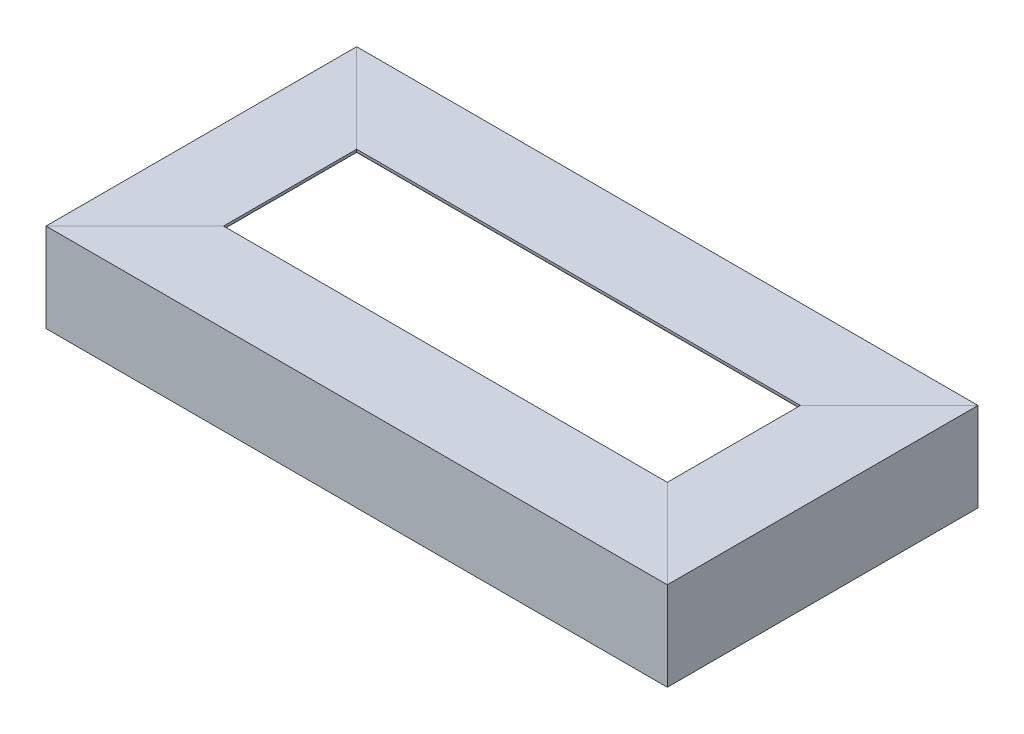
ISO-10303-21;
HEADER;
FILE_DESCRIPTION(('STEP AP214'),'2;1');
FILE_NAME('part.step','',(''),(''),'','','');
FILE_SCHEMA(('AUTOMOTIVE_DESIGN { 1 0 10303 214 1 1 1 1 }'));
ENDSEC;
DATA;
#1=APPLICATION_CONTEXT('core data for automotive mechanical design processes');
#2=APPLICATION_PROTOCOL_DEFINITION('international standard','automotive_design',2000,#1);
#3=PRODUCT_CONTEXT('',#1,'mechanical');
#4=PRODUCT('Part','Part','',(#3));
#5=PRODUCT_RELATED_PRODUCT_CATEGORY('part','',(#4));
#6=PRODUCT_DEFINITION_FORMATION('','',#4);
#7=PRODUCT_DEFINITION_CONTEXT('part definition',#1,'design');
#8=PRODUCT_DEFINITION('design','',#6,#7);
#9=PRODUCT_DEFINITION_SHAPE('','',#8);
#10=(LENGTH_UNIT() NAMED_UNIT(*) SI_UNIT(.MILLI.,.METRE.));
#11=(NAMED_UNIT(*) PLANE_ANGLE_UNIT() SI_UNIT($,.RADIAN.));
#12=(NAMED_UNIT(*) SI_UNIT($,.STERADIAN.) SOLID_ANGLE_UNIT());
#13=UNCERTAINTY_MEASURE_WITH_UNIT(LENGTH_MEASURE(1.E-05),#10,'distance_accuracy_value','');
#14=(GEOMETRIC_REPRESENTATION_CONTEXT(3) GLOBAL_UNCERTAINTY_ASSIGNED_CONTEXT((#13)) GLOBAL_UNIT_ASSIGNED_CONTEXT((#10,
#11,#12)) REPRESENTATION_CONTEXT('',''));
#15=CARTESIAN_POINT('',(0.,0.,0.));
#16=DIRECTION('',(0.,0.,1.));
#17=DIRECTION('',(1.,0.,0.));
#18=AXIS2_PLACEMENT_3D('',#15,#16,#17);
#19=CARTESIAN_POINT('',(-100.,0.,-70.));
#20=DIRECTION('',(0.,-1.,0.));
#21=DIRECTION('',(0.,0.,-1.));
#22=AXIS2_PLACEMENT_3D('',#19,#20,#21);
#23=PLANE('',#22);
#24=DIRECTION('',(-0.707106781186547,0.,0.707106781186548));
#25=VECTOR('',#24,1.);
#26=CARTESIAN_POINT('',(-50.,0.,-20.0000000000001));
#27=LINE('',#26,#25);
#28=CARTESIAN_POINT('',(-100.,0.,30.));
#29=VERTEX_POINT('',#28);
#30=CARTESIAN_POINT('',(-140.,0.,70.));
#31=VERTEX_POINT('',#30);
#32=EDGE_CURVE('E144',#29,#31,#27,.T.);
#33=ORIENTED_EDGE('',*,*,#32,.F.);
#34=DIRECTION('',(0.,0.,1.));
#35=VECTOR('',#34,1.);
#36=CARTESIAN_POINT('',(-100.,0.,-70.));
#37=LINE('',#36,#35);
#38=CARTESIAN_POINT('',(-100.,0.,-30.));
#39=VERTEX_POINT('',#38);
#40=EDGE_CURVE('E169',#39,#29,#37,.T.);
#41=ORIENTED_EDGE('',*,*,#40,.F.);
#42=DIRECTION('',(0.707106781186548,0.,0.707106781186547));
#43=VECTOR('',#42,1.);
#44=CARTESIAN_POINT('',(-120.,0.,-50.));
#45=LINE('',#44,#43);
#46=CARTESIAN_POINT('',(-140.,0.,-70.));
#47=VERTEX_POINT('',#46);
#48=EDGE_CURVE('E135',#47,#39,#45,.T.);
#49=ORIENTED_EDGE('',*,*,#48,.F.);
#50=DIRECTION('',(0.,0.,1.));
#51=VECTOR('',#50,1.);
#52=CARTESIAN_POINT('',(-140.,0.,-70.));
#53=LINE('',#52,#51);
#54=EDGE_CURVE('E78',#47,#31,#53,.T.);
#55=ORIENTED_EDGE('',*,*,#54,.T.);
#56=EDGE_LOOP('',(#33,#41,#49,#55));
#57=FACE_BOUND('',#56,.T.);
#58=ADVANCED_FACE('F74',(#57),#23,.F.);
#59=CARTESIAN_POINT('',(-103.,0.,-70.));
#60=DIRECTION('',(0.,0.,1.));
#61=DIRECTION('',(1.,0.,0.));
#62=AXIS2_PLACEMENT_3D('',#59,#60,#61);
#63=CYLINDRICAL_SURFACE('',#62,3.00000000000001);
#64=CARTESIAN_POINT('',(-103.,0.,33.));
#65=DIRECTION('',(0.707106781186548,0.,0.707106781186547));
#66=DIRECTION('',(-0.707106781186547,0.,0.707106781186548));
#67=AXIS2_PLACEMENT_3D('',#64,#65,#66);
#68=ELLIPSE('',#67,4.2426406871193,3.00000000000001);
#69=CARTESIAN_POINT('',(-103.,-3.,33.));
#70=VERTEX_POINT('',#69);
#71=EDGE_CURVE('E141',#70,#29,#68,.T.);
#72=ORIENTED_EDGE('',*,*,#71,.F.);
#73=DIRECTION('',(0.,0.,1.));
#74=VECTOR('',#73,1.);
#75=CARTESIAN_POINT('',(-103.,-3.,-70.));
#76=LINE('',#75,#74);
#77=CARTESIAN_POINT('',(-103.,-3.,-33.));
#78=VERTEX_POINT('',#77);
#79=EDGE_CURVE('E167',#78,#70,#76,.T.);
#80=ORIENTED_EDGE('',*,*,#79,.F.);
#81=CARTESIAN_POINT('',(-103.,0.,-33.));
#82=DIRECTION('',(0.707106781186547,0.,-0.707106781186548));
#83=DIRECTION('',(0.707106781186548,0.,0.707106781186547));
#84=AXIS2_PLACEMENT_3D('',#81,#82,#83);
#85=ELLIPSE('',#84,4.2426406871193,3.00000000000001);
#86=EDGE_CURVE('E191',#39,#78,#85,.T.);
#87=ORIENTED_EDGE('',*,*,#86,.F.);
#88=ORIENTED_EDGE('',*,*,#40,.T.);
#89=EDGE_LOOP('',(#72,#80,#87,#88));
#90=FACE_BOUND('',#89,.T.);
#91=ADVANCED_FACE('F183',(#90),#63,.T.);
#92=CARTESIAN_POINT('',(-133.5,-3.,-70.));
#93=DIRECTION('',(0.,1.,0.));
#94=DIRECTION('',(-1.,0.,0.));
#95=AXIS2_PLACEMENT_3D('',#92,#93,#94);
#96=PLANE('',#95);
#97=DIRECTION('',(0.707106781186547,0.,-0.707106781186548));
#98=VECTOR('',#97,1.);
#99=CARTESIAN_POINT('',(-66.75,-3.,-3.25000000000004));
#100=LINE('',#99,#98);
#101=CARTESIAN_POINT('',(-133.5,-3.,63.4999999999999));
#102=VERTEX_POINT('',#101);
#103=EDGE_CURVE('E14',#102,#70,#100,.T.);
#104=ORIENTED_EDGE('',*,*,#103,.F.);
#105=DIRECTION('',(0.,0.,1.));
#106=VECTOR('',#105,1.);
#107=CARTESIAN_POINT('',(-133.5,-3.,-70.));
#108=LINE('',#107,#106);
#109=CARTESIAN_POINT('',(-133.5,-3.,-63.5));
#110=VERTEX_POINT('',#109);
#111=EDGE_CURVE('E164',#110,#102,#108,.T.);
#112=ORIENTED_EDGE('',*,*,#111,.F.);
#113=DIRECTION('',(-0.707106781186548,0.,-0.707106781186547));
#114=VECTOR('',#113,1.);
#115=CARTESIAN_POINT('',(-136.75,-3.,-66.75));
#116=LINE('',#115,#114);
#117=EDGE_CURVE('E190',#78,#110,#116,.T.);
#118=ORIENTED_EDGE('',*,*,#117,.F.);
#119=ORIENTED_EDGE('',*,*,#79,.T.);
#120=EDGE_LOOP('',(#104,#112,#118,#119));
#121=FACE_BOUND('',#120,.T.);
#122=ADVANCED_FACE('F187',(#121),#96,.F.);
#123=CARTESIAN_POINT('',(-133.5,-6.5,-70.));
#124=DIRECTION('',(0.,0.,1.));
#125=DIRECTION('',(1.,0.,0.));
#126=AXIS2_PLACEMENT_3D('',#123,#124,#125);
#127=CYLINDRICAL_SURFACE('',#126,3.5);
#128=CARTESIAN_POINT('',(-133.5,-6.5,63.4999999999999));
#129=DIRECTION('',(0.707106781186548,0.,0.707106781186547));
#130=DIRECTION('',(-0.707106781186547,0.,0.707106781186548));
#131=AXIS2_PLACEMENT_3D('',#128,#129,#130);
#132=ELLIPSE('',#131,4.94974746830584,3.5);
#133=CARTESIAN_POINT('',(-137.,-6.5,67.));
#134=VERTEX_POINT('',#133);
#135=EDGE_CURVE('E83',#134,#102,#132,.F.);
#136=ORIENTED_EDGE('',*,*,#135,.F.);
#137=DIRECTION('',(0.,0.,1.));
#138=VECTOR('',#137,1.);
#139=CARTESIAN_POINT('',(-137.,-6.5,-70.));
#140=LINE('',#139,#138);
#141=CARTESIAN_POINT('',(-137.,-6.5,-67.));
#142=VERTEX_POINT('',#141);
#143=EDGE_CURVE('E161',#142,#134,#140,.T.);
#144=ORIENTED_EDGE('',*,*,#143,.F.);
#145=CARTESIAN_POINT('',(-133.5,-6.5,-63.5));
#146=DIRECTION('',(0.707106781186547,0.,-0.707106781186548));
#147=DIRECTION('',(0.707106781186548,0.,0.707106781186547));
#148=AXIS2_PLACEMENT_3D('',#145,#146,#147);
#149=ELLIPSE('',#148,4.94974746830584,3.5);
#150=EDGE_CURVE('E146',#110,#142,#149,.F.);
#151=ORIENTED_EDGE('',*,*,#150,.F.);
#152=ORIENTED_EDGE('',*,*,#111,.T.);
#153=EDGE_LOOP('',(#136,#144,#151,#152));
#154=FACE_BOUND('',#153,.T.);
#155=ADVANCED_FACE('F198',(#154),#127,.F.);
#156=CARTESIAN_POINT('',(-137.,-37.,-70.));
#157=DIRECTION('',(-1.,0.,0.));
#158=DIRECTION('',(0.,0.,1.));
#159=AXIS2_PLACEMENT_3D('',#156,#157,#158);
#160=PLANE('',#159);
#161=DIRECTION('',(0.,1.,0.));
#162=VECTOR('',#161,1.);
#163=CARTESIAN_POINT('',(-137.,-37.,67.));
#164=LINE('',#163,#162);
#165=CARTESIAN_POINT('',(-137.,-37.,67.));
#166=VERTEX_POINT('',#165);
#167=EDGE_CURVE('E155',#166,#134,#164,.T.);
#168=ORIENTED_EDGE('',*,*,#167,.F.);
#169=DIRECTION('',(0.,0.,1.));
#170=VECTOR('',#169,1.);
#171=CARTESIAN_POINT('',(-137.,-37.,-70.));
#172=LINE('',#171,#170);
#173=CARTESIAN_POINT('',(-137.,-37.,-67.));
#174=VERTEX_POINT('',#173);
#175=EDGE_CURVE('E129',#174,#166,#172,.T.);
#176=ORIENTED_EDGE('',*,*,#175,.F.);
#177=DIRECTION('',(0.,-1.,0.));
#178=VECTOR('',#177,1.);
#179=CARTESIAN_POINT('',(-137.,-37.,-67.));
#180=LINE('',#179,#178);
#181=EDGE_CURVE('E140',#142,#174,#180,.T.);
#182=ORIENTED_EDGE('',*,*,#181,.F.);
#183=ORIENTED_EDGE('',*,*,#143,.T.);
#184=EDGE_LOOP('',(#168,#176,#182,#183));
#185=FACE_BOUND('',#184,.T.);
#186=ADVANCED_FACE('F201',(#185),#160,.F.);
#187=CARTESIAN_POINT('',(-140.,-37.,-70.));
#188=DIRECTION('',(0.,0.,1.));
#189=DIRECTION('',(1.,0.,0.));
#190=AXIS2_PLACEMENT_3D('',#187,#188,#189);
#191=CYLINDRICAL_SURFACE('',#190,3.);
#192=CARTESIAN_POINT('',(-140.,-37.,70.));
#193=DIRECTION('',(0.707106781186548,0.,0.707106781186547));
#194=DIRECTION('',(-0.707106781186547,0.,0.707106781186548));
#195=AXIS2_PLACEMENT_3D('',#192,#193,#194);
#196=ELLIPSE('',#195,4.24264068711929,3.);
#197=CARTESIAN_POINT('',(-140.,-40.,70.));
#198=VERTEX_POINT('',#197);
#199=EDGE_CURVE('E126',#198,#166,#196,.T.);
#200=ORIENTED_EDGE('',*,*,#199,.F.);
#201=DIRECTION('',(0.,0.,1.));
#202=VECTOR('',#201,1.);
#203=CARTESIAN_POINT('',(-140.,-40.,-70.));
#204=LINE('',#203,#202);
#205=CARTESIAN_POINT('',(-140.,-40.,-70.));
#206=VERTEX_POINT('',#205);
#207=EDGE_CURVE('E91',#206,#198,#204,.T.);
#208=ORIENTED_EDGE('',*,*,#207,.F.);
#209=CARTESIAN_POINT('',(-140.,-37.,-70.));
#210=DIRECTION('',(0.707106781186547,0.,-0.707106781186548));
#211=DIRECTION('',(0.707106781186548,0.,0.707106781186547));
#212=AXIS2_PLACEMENT_3D('',#209,#210,#211);
#213=ELLIPSE('',#212,4.24264068711929,3.);
#214=EDGE_CURVE('E123',#174,#206,#213,.T.);
#215=ORIENTED_EDGE('',*,*,#214,.F.);
#216=ORIENTED_EDGE('',*,*,#175,.T.);
#217=EDGE_LOOP('',(#200,#208,#215,#216));
#218=FACE_BOUND('',#217,.T.);
#219=ADVANCED_FACE('F120',(#218),#191,.T.);
#220=CARTESIAN_POINT('',(-140.,0.,-70.));
#221=DIRECTION('',(1.,0.,0.));
#222=DIRECTION('',(0.,0.,-1.));
#223=AXIS2_PLACEMENT_3D('',#220,#221,#222);
#224=PLANE('',#223);
#225=DIRECTION('',(0.,-1.,0.));
#226=VECTOR('',#225,1.);
#227=CARTESIAN_POINT('',(-140.,0.,70.));
#228=LINE('',#227,#226);
#229=EDGE_CURVE('E151',#31,#198,#228,.T.);
#230=ORIENTED_EDGE('',*,*,#229,.F.);
#231=ORIENTED_EDGE('',*,*,#54,.F.);
#232=DIRECTION('',(0.,1.,0.));
#233=VECTOR('',#232,1.);
#234=CARTESIAN_POINT('',(-140.,0.,-70.));
#235=LINE('',#234,#233);
#236=EDGE_CURVE('E128',#206,#47,#235,.T.);
#237=ORIENTED_EDGE('',*,*,#236,.F.);
#238=ORIENTED_EDGE('',*,*,#207,.T.);
#239=EDGE_LOOP('',(#230,#231,#237,#238));
#240=FACE_BOUND('',#239,.T.);
#241=ADVANCED_FACE('F132',(#240),#224,.F.);
#242=CARTESIAN_POINT('',(-140.,0.,-70.));
#243=DIRECTION('',(0.707106781186547,0.,-0.707106781186548));
#244=DIRECTION('',(-0.707106781186548,0.,-0.707106781186547));
#245=AXIS2_PLACEMENT_3D('',#242,#243,#244);
#246=PLANE('',#245);
#247=ORIENTED_EDGE('',*,*,#236,.T.);
#248=ORIENTED_EDGE('',*,*,#48,.T.);
#249=ORIENTED_EDGE('',*,*,#86,.T.);
#250=ORIENTED_EDGE('',*,*,#117,.T.);
#251=ORIENTED_EDGE('',*,*,#150,.T.);
#252=ORIENTED_EDGE('',*,*,#181,.T.);
#253=ORIENTED_EDGE('',*,*,#214,.T.);
#254=EDGE_LOOP('',(#247,#248,#249,#250,#251,#252,#253));
#255=FACE_BOUND('',#254,.T.);
#256=ADVANCED_FACE('F138',(#255),#246,.T.);
#257=CARTESIAN_POINT('',(-140.,0.,70.));
#258=DIRECTION('',(0.707106781186548,0.,0.707106781186547));
#259=DIRECTION('',(0.707106781186547,0.,-0.707106781186548));
#260=AXIS2_PLACEMENT_3D('',#257,#258,#259);
#261=PLANE('',#260);
#262=ORIENTED_EDGE('',*,*,#71,.T.);
#263=ORIENTED_EDGE('',*,*,#32,.T.);
#264=ORIENTED_EDGE('',*,*,#229,.T.);
#265=ORIENTED_EDGE('',*,*,#199,.T.);
#266=ORIENTED_EDGE('',*,*,#167,.T.);
#267=ORIENTED_EDGE('',*,*,#135,.T.);
#268=ORIENTED_EDGE('',*,*,#103,.T.);
#269=EDGE_LOOP('',(#262,#263,#264,#265,#266,#267,#268));
#270=FACE_BOUND('',#269,.T.);
#271=ADVANCED_FACE('F76',(#270),#261,.T.);
#272=CLOSED_SHELL('',(#58,#91,#122,#155,#186,#219,#241,#256,#271));
#273=MANIFOLD_SOLID_BREP('B2',#272);
#274=CARTESIAN_POINT('',(-140.,0.,29.9999999999999));
#275=DIRECTION('',(0.,-1.,0.));
#276=DIRECTION('',(0.,0.,-1.));
#277=AXIS2_PLACEMENT_3D('',#274,#275,#276);
#278=PLANE('',#277);
#279=DIRECTION('',(0.707106781186548,0.,-0.707106781186548));
#280=VECTOR('',#279,1.);
#281=CARTESIAN_POINT('',(-120.,0.,50.));
#282=LINE('',#281,#280);
#283=CARTESIAN_POINT('',(-140.,0.,69.9999999999999));
#284=VERTEX_POINT('',#283);
#285=CARTESIAN_POINT('',(-99.9999999999999,0.,29.9999999999999));
#286=VERTEX_POINT('',#285);
#287=EDGE_CURVE('E411',#284,#286,#282,.T.);
#288=ORIENTED_EDGE('',*,*,#287,.F.);
#289=DIRECTION('',(1.,0.,0.));
#290=VECTOR('',#289,1.);
#291=CARTESIAN_POINT('',(-140.,0.,69.9999999999999));
#292=LINE('',#291,#290);
#293=CARTESIAN_POINT('',(140.,0.,69.9999999999999));
#294=VERTEX_POINT('',#293);
#295=EDGE_CURVE('E325',#284,#294,#292,.T.);
#296=ORIENTED_EDGE('',*,*,#295,.T.);
#297=DIRECTION('',(0.707106781186548,0.,0.707106781186547));
#298=VECTOR('',#297,1.);
#299=CARTESIAN_POINT('',(-20.0000000000001,0.,-90.0000000000001));
#300=LINE('',#299,#298);
#301=CARTESIAN_POINT('',(99.9999999999999,0.,29.9999999999999));
#302=VERTEX_POINT('',#301);
#303=EDGE_CURVE('E428',#302,#294,#300,.T.);
#304=ORIENTED_EDGE('',*,*,#303,.F.);
#305=DIRECTION('',(1.,0.,0.));
#306=VECTOR('',#305,1.);
#307=CARTESIAN_POINT('',(-140.,0.,29.9999999999999));
#308=LINE('',#307,#306);
#309=EDGE_CURVE('E422',#286,#302,#308,.T.);
#310=ORIENTED_EDGE('',*,*,#309,.F.);
#311=EDGE_LOOP('',(#288,#296,#304,#310));
#312=FACE_BOUND('',#311,.T.);
#313=ADVANCED_FACE('F321',(#312),#278,.F.);
#314=CARTESIAN_POINT('',(-140.,0.,32.9999999999999));
#315=DIRECTION('',(1.,0.,0.));
#316=DIRECTION('',(0.,0.,-1.));
#317=AXIS2_PLACEMENT_3D('',#314,#315,#316);
#318=CYLINDRICAL_SURFACE('',#317,3.00000000000001);
#319=CARTESIAN_POINT('',(-103.,0.,32.9999999999999));
#320=DIRECTION('',(-0.707106781186548,0.,-0.707106781186548));
#321=DIRECTION('',(0.707106781186548,0.,-0.707106781186548));
#322=AXIS2_PLACEMENT_3D('',#319,#320,#321);
#323=ELLIPSE('',#322,4.2426406871193,3.00000000000001);
#324=CARTESIAN_POINT('',(-103.,-3.,32.9999999999999));
#325=VERTEX_POINT('',#324);
#326=EDGE_CURVE('E376',#286,#325,#323,.T.);
#327=ORIENTED_EDGE('',*,*,#326,.F.);
#328=ORIENTED_EDGE('',*,*,#309,.T.);
#329=CARTESIAN_POINT('',(103.,0.,32.9999999999999));
#330=DIRECTION('',(0.707106781186547,0.,-0.707106781186548));
#331=DIRECTION('',(0.707106781186548,0.,0.707106781186547));
#332=AXIS2_PLACEMENT_3D('',#329,#330,#331);
#333=ELLIPSE('',#332,4.2426406871193,3.00000000000001);
#334=CARTESIAN_POINT('',(103.,-3.,32.9999999999999));
#335=VERTEX_POINT('',#334);
#336=EDGE_CURVE('E418',#335,#302,#333,.T.);
#337=ORIENTED_EDGE('',*,*,#336,.F.);
#338=DIRECTION('',(1.,0.,0.));
#339=VECTOR('',#338,1.);
#340=CARTESIAN_POINT('',(-140.,-3.,32.9999999999999));
#341=LINE('',#340,#339);
#342=EDGE_CURVE('E421',#325,#335,#341,.T.);
#343=ORIENTED_EDGE('',*,*,#342,.F.);
#344=EDGE_LOOP('',(#327,#328,#337,#343));
#345=FACE_BOUND('',#344,.T.);
#346=ADVANCED_FACE('F424',(#345),#318,.T.);
#347=CARTESIAN_POINT('',(-140.,-3.,63.4999999999999));
#348=DIRECTION('',(0.,1.,0.));
#349=DIRECTION('',(0.,0.,1.));
#350=AXIS2_PLACEMENT_3D('',#347,#348,#349);
#351=PLANE('',#350);
#352=DIRECTION('',(-0.707106781186548,0.,0.707106781186548));
#353=VECTOR('',#352,1.);
#354=CARTESIAN_POINT('',(-136.75,-3.,66.75));
#355=LINE('',#354,#353);
#356=CARTESIAN_POINT('',(-133.5,-3.,63.4999999999999));
#357=VERTEX_POINT('',#356);
#358=EDGE_CURVE('E406',#325,#357,#355,.T.);
#359=ORIENTED_EDGE('',*,*,#358,.F.);
#360=ORIENTED_EDGE('',*,*,#342,.T.);
#361=DIRECTION('',(-0.707106781186548,0.,-0.707106781186547));
#362=VECTOR('',#361,1.);
#363=CARTESIAN_POINT('',(-3.25000000000006,-3.,-73.2500000000001));
#364=LINE('',#363,#362);
#365=CARTESIAN_POINT('',(133.5,-3.,63.4999999999999));
#366=VERTEX_POINT('',#365);
#367=EDGE_CURVE('E416',#366,#335,#364,.T.);
#368=ORIENTED_EDGE('',*,*,#367,.F.);
#369=DIRECTION('',(1.,0.,0.));
#370=VECTOR('',#369,1.);
#371=CARTESIAN_POINT('',(-140.,-3.,63.4999999999999));
#372=LINE('',#371,#370);
#373=EDGE_CURVE('E402',#357,#366,#372,.T.);
#374=ORIENTED_EDGE('',*,*,#373,.F.);
#375=EDGE_LOOP('',(#359,#360,#368,#374));
#376=FACE_BOUND('',#375,.T.);
#377=ADVANCED_FACE('F459',(#376),#351,.F.);
#378=CARTESIAN_POINT('',(-140.,-6.5,63.4999999999999));
#379=DIRECTION('',(1.,0.,0.));
#380=DIRECTION('',(0.,0.,-1.));
#381=AXIS2_PLACEMENT_3D('',#378,#379,#380);
#382=CYLINDRICAL_SURFACE('',#381,3.5);
#383=CARTESIAN_POINT('',(-133.5,-6.5,63.4999999999999));
#384=DIRECTION('',(-0.707106781186548,0.,-0.707106781186548));
#385=DIRECTION('',(0.707106781186548,0.,-0.707106781186548));
#386=AXIS2_PLACEMENT_3D('',#383,#384,#385);
#387=ELLIPSE('',#386,4.94974746830584,3.5);
#388=CARTESIAN_POINT('',(-137.,-6.5,66.9999999999999));
#389=VERTEX_POINT('',#388);
#390=EDGE_CURVE('E394',#357,#389,#387,.F.);
#391=ORIENTED_EDGE('',*,*,#390,.F.);
#392=ORIENTED_EDGE('',*,*,#373,.T.);
#393=CARTESIAN_POINT('',(133.5,-6.5,63.4999999999999));
#394=DIRECTION('',(0.707106781186547,0.,-0.707106781186548));
#395=DIRECTION('',(0.707106781186548,0.,0.707106781186547));
#396=AXIS2_PLACEMENT_3D('',#393,#394,#395);
#397=ELLIPSE('',#396,4.94974746830584,3.5);
#398=CARTESIAN_POINT('',(137.,-6.5,66.9999999999999));
#399=VERTEX_POINT('',#398);
#400=EDGE_CURVE('E400',#399,#366,#397,.F.);
#401=ORIENTED_EDGE('',*,*,#400,.F.);
#402=DIRECTION('',(1.,0.,0.));
#403=VECTOR('',#402,1.);
#404=CARTESIAN_POINT('',(-140.,-6.5,66.9999999999999));
#405=LINE('',#404,#403);
#406=EDGE_CURVE('E389',#389,#399,#405,.T.);
#407=ORIENTED_EDGE('',*,*,#406,.F.);
#408=EDGE_LOOP('',(#391,#392,#401,#407));
#409=FACE_BOUND('',#408,.T.);
#410=ADVANCED_FACE('F397',(#409),#382,.F.);
#411=CARTESIAN_POINT('',(-140.,-37.,66.9999999999999));
#412=DIRECTION('',(0.,0.,1.));
#413=DIRECTION('',(1.,0.,0.));
#414=AXIS2_PLACEMENT_3D('',#411,#412,#413);
#415=PLANE('',#414);
#416=DIRECTION('',(0.,-1.,0.));
#417=VECTOR('',#416,1.);
#418=CARTESIAN_POINT('',(-137.,-37.,66.9999999999999));
#419=LINE('',#418,#417);
#420=CARTESIAN_POINT('',(-137.,-37.,66.9999999999999));
#421=VERTEX_POINT('',#420);
#422=EDGE_CURVE('E330',#389,#421,#419,.T.);
#423=ORIENTED_EDGE('',*,*,#422,.F.);
#424=ORIENTED_EDGE('',*,*,#406,.T.);
#425=DIRECTION('',(0.,1.,0.));
#426=VECTOR('',#425,1.);
#427=CARTESIAN_POINT('',(137.,-37.,66.9999999999999));
#428=LINE('',#427,#426);
#429=CARTESIAN_POINT('',(137.,-37.,66.9999999999999));
#430=VERTEX_POINT('',#429);
#431=EDGE_CURVE('E439',#430,#399,#428,.T.);
#432=ORIENTED_EDGE('',*,*,#431,.F.);
#433=DIRECTION('',(1.,0.,0.));
#434=VECTOR('',#433,1.);
#435=CARTESIAN_POINT('',(-140.,-37.,66.9999999999999));
#436=LINE('',#435,#434);
#437=EDGE_CURVE('E391',#421,#430,#436,.T.);
#438=ORIENTED_EDGE('',*,*,#437,.F.);
#439=EDGE_LOOP('',(#423,#424,#432,#438));
#440=FACE_BOUND('',#439,.T.);
#441=ADVANCED_FACE('F387',(#440),#415,.F.);
#442=CARTESIAN_POINT('',(-140.,-37.,69.9999999999999));
#443=DIRECTION('',(1.,0.,0.));
#444=DIRECTION('',(0.,0.,-1.));
#445=AXIS2_PLACEMENT_3D('',#442,#443,#444);
#446=CYLINDRICAL_SURFACE('',#445,3.);
#447=CARTESIAN_POINT('',(-140.,-37.,69.9999999999999));
#448=DIRECTION('',(-0.707106781186548,0.,-0.707106781186548));
#449=DIRECTION('',(0.707106781186548,0.,-0.707106781186548));
#450=AXIS2_PLACEMENT_3D('',#447,#448,#449);
#451=ELLIPSE('',#450,4.24264068711929,3.);
#452=CARTESIAN_POINT('',(-140.,-40.,69.9999999999999));
#453=VERTEX_POINT('',#452);
#454=EDGE_CURVE('E72',#421,#453,#451,.T.);
#455=ORIENTED_EDGE('',*,*,#454,.F.);
#456=ORIENTED_EDGE('',*,*,#437,.T.);
#457=CARTESIAN_POINT('',(140.,-37.,69.9999999999999));
#458=DIRECTION('',(0.707106781186547,0.,-0.707106781186548));
#459=DIRECTION('',(0.707106781186548,0.,0.707106781186547));
#460=AXIS2_PLACEMENT_3D('',#457,#458,#459);
#461=ELLIPSE('',#460,4.24264068711929,3.);
#462=CARTESIAN_POINT('',(140.,-40.,69.9999999999999));
#463=VERTEX_POINT('',#462);
#464=EDGE_CURVE('E441',#463,#430,#461,.T.);
#465=ORIENTED_EDGE('',*,*,#464,.F.);
#466=DIRECTION('',(1.,0.,0.));
#467=VECTOR('',#466,1.);
#468=CARTESIAN_POINT('',(-140.,-40.,69.9999999999999));
#469=LINE('',#468,#467);
#470=EDGE_CURVE('E343',#453,#463,#469,.T.);
#471=ORIENTED_EDGE('',*,*,#470,.F.);
#472=EDGE_LOOP('',(#455,#456,#465,#471));
#473=FACE_BOUND('',#472,.T.);
#474=ADVANCED_FACE('F446',(#473),#446,.T.);
#475=CARTESIAN_POINT('',(-140.,0.,69.9999999999999));
#476=DIRECTION('',(0.,0.,-1.));
#477=DIRECTION('',(-1.,0.,0.));
#478=AXIS2_PLACEMENT_3D('',#475,#476,#477);
#479=PLANE('',#478);
#480=DIRECTION('',(0.,1.,0.));
#481=VECTOR('',#480,1.);
#482=CARTESIAN_POINT('',(-140.,0.,69.9999999999999));
#483=LINE('',#482,#481);
#484=EDGE_CURVE('E414',#453,#284,#483,.T.);
#485=ORIENTED_EDGE('',*,*,#484,.F.);
#486=ORIENTED_EDGE('',*,*,#470,.T.);
#487=DIRECTION('',(0.,-1.,0.));
#488=VECTOR('',#487,1.);
#489=CARTESIAN_POINT('',(140.,0.,69.9999999999999));
#490=LINE('',#489,#488);
#491=EDGE_CURVE('E431',#294,#463,#490,.T.);
#492=ORIENTED_EDGE('',*,*,#491,.F.);
#493=ORIENTED_EDGE('',*,*,#295,.F.);
#494=EDGE_LOOP('',(#485,#486,#492,#493));
#495=FACE_BOUND('',#494,.T.);
#496=ADVANCED_FACE('F444',(#495),#479,.F.);
#497=CARTESIAN_POINT('',(140.,0.,70.));
#498=DIRECTION('',(0.707106781186547,0.,-0.707106781186548));
#499=DIRECTION('',(-0.707106781186548,0.,-0.707106781186547));
#500=AXIS2_PLACEMENT_3D('',#497,#498,#499);
#501=PLANE('',#500);
#502=ORIENTED_EDGE('',*,*,#336,.T.);
#503=ORIENTED_EDGE('',*,*,#303,.T.);
#504=ORIENTED_EDGE('',*,*,#491,.T.);
#505=ORIENTED_EDGE('',*,*,#464,.T.);
#506=ORIENTED_EDGE('',*,*,#431,.T.);
#507=ORIENTED_EDGE('',*,*,#400,.T.);
#508=ORIENTED_EDGE('',*,*,#367,.T.);
#509=EDGE_LOOP('',(#502,#503,#504,#505,#506,#507,#508));
#510=FACE_BOUND('',#509,.T.);
#511=ADVANCED_FACE('F433',(#510),#501,.T.);
#512=CARTESIAN_POINT('',(-140.,0.,70.));
#513=DIRECTION('',(-0.707106781186548,0.,-0.707106781186548));
#514=DIRECTION('',(-0.707106781186548,0.,0.707106781186548));
#515=AXIS2_PLACEMENT_3D('',#512,#513,#514);
#516=PLANE('',#515);
#517=ORIENTED_EDGE('',*,*,#484,.T.);
#518=ORIENTED_EDGE('',*,*,#287,.T.);
#519=ORIENTED_EDGE('',*,*,#326,.T.);
#520=ORIENTED_EDGE('',*,*,#358,.T.);
#521=ORIENTED_EDGE('',*,*,#390,.T.);
#522=ORIENTED_EDGE('',*,*,#422,.T.);
#523=ORIENTED_EDGE('',*,*,#454,.T.);
#524=EDGE_LOOP('',(#517,#518,#519,#520,#521,#522,#523));
#525=FACE_BOUND('',#524,.T.);
#526=ADVANCED_FACE('F323',(#525),#516,.T.);
#527=CLOSED_SHELL('',(#313,#346,#377,#410,#441,#474,#496,#511,#526));
#528=MANIFOLD_SOLID_BREP('B8',#527);
#529=CARTESIAN_POINT('',(140.,0.,-30.));
#530=DIRECTION('',(0.,-1.,0.));
#531=DIRECTION('',(0.,0.,-1.));
#532=AXIS2_PLACEMENT_3D('',#529,#530,#531);
#533=PLANE('',#532);
#534=DIRECTION('',(-0.707106781186547,0.,-0.707106781186548));
#535=VECTOR('',#534,1.);
#536=CARTESIAN_POINT('',(20.,0.,90.));
#537=LINE('',#536,#535);
#538=CARTESIAN_POINT('',(-100.,0.,-30.0000000000001));
#539=VERTEX_POINT('',#538);
#540=CARTESIAN_POINT('',(-140.,0.,-70.));
#541=VERTEX_POINT('',#540);
#542=EDGE_CURVE('E637',#539,#541,#537,.T.);
#543=ORIENTED_EDGE('',*,*,#542,.F.);
#544=DIRECTION('',(-1.,0.,0.));
#545=VECTOR('',#544,1.);
#546=CARTESIAN_POINT('',(140.,0.,-30.0000000000001));
#547=LINE('',#546,#545);
#548=CARTESIAN_POINT('',(100.,0.,-30.0000000000001));
#549=VERTEX_POINT('',#548);
#550=EDGE_CURVE('E662',#549,#539,#547,.T.);
#551=ORIENTED_EDGE('',*,*,#550,.F.);
#552=DIRECTION('',(-0.707106781186547,0.,0.707106781186548));
#553=VECTOR('',#552,1.);
#554=CARTESIAN_POINT('',(120.,0.,-50.));
#555=LINE('',#554,#553);
#556=CARTESIAN_POINT('',(140.,0.,-70.));
#557=VERTEX_POINT('',#556);
#558=EDGE_CURVE('E628',#557,#549,#555,.T.);
#559=ORIENTED_EDGE('',*,*,#558,.F.);
#560=DIRECTION('',(-1.,0.,0.));
#561=VECTOR('',#560,1.);
#562=CARTESIAN_POINT('',(140.,0.,-70.));
#563=LINE('',#562,#561);
#564=EDGE_CURVE('E571',#557,#541,#563,.T.);
#565=ORIENTED_EDGE('',*,*,#564,.T.);
#566=EDGE_LOOP('',(#543,#551,#559,#565));
#567=FACE_BOUND('',#566,.T.);
#568=ADVANCED_FACE('F567',(#567),#533,.F.);
#569=CARTESIAN_POINT('',(140.,0.,-33.0000000000001));
#570=DIRECTION('',(-1.,0.,0.));
#571=DIRECTION('',(0.,0.,1.));
#572=AXIS2_PLACEMENT_3D('',#569,#570,#571);
#573=CYLINDRICAL_SURFACE('',#572,3.00000000000001);
#574=CARTESIAN_POINT('',(-103.,0.,-33.0000000000001));
#575=DIRECTION('',(-0.707106781186548,0.,0.707106781186547));
#576=DIRECTION('',(-0.707106781186547,0.,-0.707106781186548));
#577=AXIS2_PLACEMENT_3D('',#574,#575,#576);
#578=ELLIPSE('',#577,4.2426406871193,3.00000000000001);
#579=CARTESIAN_POINT('',(-103.,-3.,-33.));
#580=VERTEX_POINT('',#579);
#581=EDGE_CURVE('E634',#580,#539,#578,.T.);
#582=ORIENTED_EDGE('',*,*,#581,.F.);
#583=DIRECTION('',(-1.,0.,0.));
#584=VECTOR('',#583,1.);
#585=CARTESIAN_POINT('',(140.,-3.,-33.0000000000001));
#586=LINE('',#585,#584);
#587=CARTESIAN_POINT('',(103.,-3.,-33.0000000000001));
#588=VERTEX_POINT('',#587);
#589=EDGE_CURVE('E660',#588,#580,#586,.T.);
#590=ORIENTED_EDGE('',*,*,#589,.F.);
#591=CARTESIAN_POINT('',(103.,0.,-33.0000000000001));
#592=DIRECTION('',(0.707106781186548,0.,0.707106781186547));
#593=DIRECTION('',(-0.707106781186547,0.,0.707106781186548));
#594=AXIS2_PLACEMENT_3D('',#591,#592,#593);
#595=ELLIPSE('',#594,4.2426406871193,3.00000000000001);
#596=EDGE_CURVE('E684',#549,#588,#595,.T.);
#597=ORIENTED_EDGE('',*,*,#596,.F.);
#598=ORIENTED_EDGE('',*,*,#550,.T.);
#599=EDGE_LOOP('',(#582,#590,#597,#598));
#600=FACE_BOUND('',#599,.T.);
#601=ADVANCED_FACE('F676',(#600),#573,.T.);
#602=CARTESIAN_POINT('',(140.,-3.,-63.5));
#603=DIRECTION('',(0.,1.,0.));
#604=DIRECTION('',(0.,0.,1.));
#605=AXIS2_PLACEMENT_3D('',#602,#603,#604);
#606=PLANE('',#605);
#607=DIRECTION('',(0.707106781186547,0.,0.707106781186548));
#608=VECTOR('',#607,1.);
#609=CARTESIAN_POINT('',(3.24999999999998,-3.,73.25));
#610=LINE('',#609,#608);
#611=CARTESIAN_POINT('',(-133.5,-3.,-63.5));
#612=VERTEX_POINT('',#611);
#613=EDGE_CURVE('E319',#612,#580,#610,.T.);
#614=ORIENTED_EDGE('',*,*,#613,.F.);
#615=DIRECTION('',(-1.,0.,0.));
#616=VECTOR('',#615,1.);
#617=CARTESIAN_POINT('',(140.,-3.,-63.5));
#618=LINE('',#617,#616);
#619=CARTESIAN_POINT('',(133.5,-3.,-63.5));
#620=VERTEX_POINT('',#619);
#621=EDGE_CURVE('E657',#620,#612,#618,.T.);
#622=ORIENTED_EDGE('',*,*,#621,.F.);
#623=DIRECTION('',(0.707106781186547,0.,-0.707106781186548));
#624=VECTOR('',#623,1.);
#625=CARTESIAN_POINT('',(136.75,-3.,-66.75));
#626=LINE('',#625,#624);
#627=EDGE_CURVE('E683',#588,#620,#626,.T.);
#628=ORIENTED_EDGE('',*,*,#627,.F.);
#629=ORIENTED_EDGE('',*,*,#589,.T.);
#630=EDGE_LOOP('',(#614,#622,#628,#629));
#631=FACE_BOUND('',#630,.T.);
#632=ADVANCED_FACE('F680',(#631),#606,.F.);
#633=CARTESIAN_POINT('',(140.,-6.5,-63.5));
#634=DIRECTION('',(-1.,0.,0.));
#635=DIRECTION('',(0.,0.,1.));
#636=AXIS2_PLACEMENT_3D('',#633,#634,#635);
#637=CYLINDRICAL_SURFACE('',#636,3.5);
#638=CARTESIAN_POINT('',(-133.5,-6.5,-63.5));
#639=DIRECTION('',(-0.707106781186548,0.,0.707106781186547));
#640=DIRECTION('',(-0.707106781186547,0.,-0.707106781186548));
#641=AXIS2_PLACEMENT_3D('',#638,#639,#640);
#642=ELLIPSE('',#641,4.94974746830584,3.5);
#643=CARTESIAN_POINT('',(-137.,-6.5,-67.));
#644=VERTEX_POINT('',#643);
#645=EDGE_CURVE('E576',#644,#612,#642,.F.);
#646=ORIENTED_EDGE('',*,*,#645,.F.);
#647=DIRECTION('',(-1.,0.,0.));
#648=VECTOR('',#647,1.);
#649=CARTESIAN_POINT('',(140.,-6.5,-67.));
#650=LINE('',#649,#648);
#651=CARTESIAN_POINT('',(137.,-6.5,-67.));
#652=VERTEX_POINT('',#651);
#653=EDGE_CURVE('E654',#652,#644,#650,.T.);
#654=ORIENTED_EDGE('',*,*,#653,.F.);
#655=CARTESIAN_POINT('',(133.5,-6.5,-63.5));
#656=DIRECTION('',(0.707106781186548,0.,0.707106781186547));
#657=DIRECTION('',(-0.707106781186547,0.,0.707106781186548));
#658=AXIS2_PLACEMENT_3D('',#655,#656,#657);
#659=ELLIPSE('',#658,4.94974746830584,3.5);
#660=EDGE_CURVE('E639',#620,#652,#659,.F.);
#661=ORIENTED_EDGE('',*,*,#660,.F.);
#662=ORIENTED_EDGE('',*,*,#621,.T.);
#663=EDGE_LOOP('',(#646,#654,#661,#662));
#664=FACE_BOUND('',#663,.T.);
#665=ADVANCED_FACE('F691',(#664),#637,.F.);
#666=CARTESIAN_POINT('',(140.,-37.,-67.));
#667=DIRECTION('',(0.,0.,-1.));
#668=DIRECTION('',(-1.,0.,0.));
#669=AXIS2_PLACEMENT_3D('',#666,#667,#668);
#670=PLANE('',#669);
#671=DIRECTION('',(0.,1.,0.));
#672=VECTOR('',#671,1.);
#673=CARTESIAN_POINT('',(-137.,-37.,-67.));
#674=LINE('',#673,#672);
#675=CARTESIAN_POINT('',(-137.,-37.,-67.));
#676=VERTEX_POINT('',#675);
#677=EDGE_CURVE('E648',#676,#644,#674,.T.);
#678=ORIENTED_EDGE('',*,*,#677,.F.);
#679=DIRECTION('',(-1.,0.,0.));
#680=VECTOR('',#679,1.);
#681=CARTESIAN_POINT('',(140.,-37.,-67.));
#682=LINE('',#681,#680);
#683=CARTESIAN_POINT('',(137.,-37.,-67.));
#684=VERTEX_POINT('',#683);
#685=EDGE_CURVE('E622',#684,#676,#682,.T.);
#686=ORIENTED_EDGE('',*,*,#685,.F.);
#687=DIRECTION('',(0.,-1.,0.));
#688=VECTOR('',#687,1.);
#689=CARTESIAN_POINT('',(137.,-37.,-67.));
#690=LINE('',#689,#688);
#691=EDGE_CURVE('E633',#652,#684,#690,.T.);
#692=ORIENTED_EDGE('',*,*,#691,.F.);
#693=ORIENTED_EDGE('',*,*,#653,.T.);
#694=EDGE_LOOP('',(#678,#686,#692,#693));
#695=FACE_BOUND('',#694,.T.);
#696=ADVANCED_FACE('F694',(#695),#670,.F.);
#697=CARTESIAN_POINT('',(140.,-37.,-70.));
#698=DIRECTION('',(-1.,0.,0.));
#699=DIRECTION('',(0.,0.,1.));
#700=AXIS2_PLACEMENT_3D('',#697,#698,#699);
#701=CYLINDRICAL_SURFACE('',#700,3.);
#702=CARTESIAN_POINT('',(-140.,-37.,-70.));
#703=DIRECTION('',(-0.707106781186548,0.,0.707106781186547));
#704=DIRECTION('',(-0.707106781186547,0.,-0.707106781186548));
#705=AXIS2_PLACEMENT_3D('',#702,#703,#704);
#706=ELLIPSE('',#705,4.24264068711929,3.);
#707=CARTESIAN_POINT('',(-140.,-40.,-70.));
#708=VERTEX_POINT('',#707);
#709=EDGE_CURVE('E619',#708,#676,#706,.T.);
#710=ORIENTED_EDGE('',*,*,#709,.F.);
#711=DIRECTION('',(-1.,0.,0.));
#712=VECTOR('',#711,1.);
#713=CARTESIAN_POINT('',(140.,-40.,-70.));
#714=LINE('',#713,#712);
#715=CARTESIAN_POINT('',(140.,-40.,-70.));
#716=VERTEX_POINT('',#715);
#717=EDGE_CURVE('E584',#716,#708,#714,.T.);
#718=ORIENTED_EDGE('',*,*,#717,.F.);
#719=CARTESIAN_POINT('',(140.,-37.,-70.));
#720=DIRECTION('',(0.707106781186548,0.,0.707106781186547));
#721=DIRECTION('',(-0.707106781186547,0.,0.707106781186548));
#722=AXIS2_PLACEMENT_3D('',#719,#720,#721);
#723=ELLIPSE('',#722,4.24264068711929,3.);
#724=EDGE_CURVE('E616',#684,#716,#723,.T.);
#725=ORIENTED_EDGE('',*,*,#724,.F.);
#726=ORIENTED_EDGE('',*,*,#685,.T.);
#727=EDGE_LOOP('',(#710,#718,#725,#726));
#728=FACE_BOUND('',#727,.T.);
#729=ADVANCED_FACE('F613',(#728),#701,.T.);
#730=CARTESIAN_POINT('',(140.,0.,-70.));
#731=DIRECTION('',(0.,0.,1.));
#732=DIRECTION('',(1.,0.,0.));
#733=AXIS2_PLACEMENT_3D('',#730,#731,#732);
#734=PLANE('',#733);
#735=DIRECTION('',(0.,-1.,0.));
#736=VECTOR('',#735,1.);
#737=CARTESIAN_POINT('',(-140.,0.,-70.));
#738=LINE('',#737,#736);
#739=EDGE_CURVE('E644',#541,#708,#738,.T.);
#740=ORIENTED_EDGE('',*,*,#739,.F.);
#741=ORIENTED_EDGE('',*,*,#564,.F.);
#742=DIRECTION('',(0.,1.,0.));
#743=VECTOR('',#742,1.);
#744=CARTESIAN_POINT('',(140.,0.,-70.));
#745=LINE('',#744,#743);
#746=EDGE_CURVE('E621',#716,#557,#745,.T.);
#747=ORIENTED_EDGE('',*,*,#746,.F.);
#748=ORIENTED_EDGE('',*,*,#717,.T.);
#749=EDGE_LOOP('',(#740,#741,#747,#748));
#750=FACE_BOUND('',#749,.T.);
#751=ADVANCED_FACE('F625',(#750),#734,.F.);
#752=CARTESIAN_POINT('',(140.,0.,-70.));
#753=DIRECTION('',(0.707106781186548,0.,0.707106781186547));
#754=DIRECTION('',(0.707106781186547,0.,-0.707106781186548));
#755=AXIS2_PLACEMENT_3D('',#752,#753,#754);
#756=PLANE('',#755);
#757=ORIENTED_EDGE('',*,*,#746,.T.);
#758=ORIENTED_EDGE('',*,*,#558,.T.);
#759=ORIENTED_EDGE('',*,*,#596,.T.);
#760=ORIENTED_EDGE('',*,*,#627,.T.);
#761=ORIENTED_EDGE('',*,*,#660,.T.);
#762=ORIENTED_EDGE('',*,*,#691,.T.);
#763=ORIENTED_EDGE('',*,*,#724,.T.);
#764=EDGE_LOOP('',(#757,#758,#759,#760,#761,#762,#763));
#765=FACE_BOUND('',#764,.T.);
#766=ADVANCED_FACE('F631',(#765),#756,.T.);
#767=CARTESIAN_POINT('',(-140.,0.,-70.));
#768=DIRECTION('',(-0.707106781186548,0.,0.707106781186547));
#769=DIRECTION('',(0.707106781186547,0.,0.707106781186548));
#770=AXIS2_PLACEMENT_3D('',#767,#768,#769);
#771=PLANE('',#770);
#772=ORIENTED_EDGE('',*,*,#581,.T.);
#773=ORIENTED_EDGE('',*,*,#542,.T.);
#774=ORIENTED_EDGE('',*,*,#739,.T.);
#775=ORIENTED_EDGE('',*,*,#709,.T.);
#776=ORIENTED_EDGE('',*,*,#677,.T.);
#777=ORIENTED_EDGE('',*,*,#645,.T.);
#778=ORIENTED_EDGE('',*,*,#613,.T.);
#779=EDGE_LOOP('',(#772,#773,#774,#775,#776,#777,#778));
#780=FACE_BOUND('',#779,.T.);
#781=ADVANCED_FACE('F569',(#780),#771,.T.);
#782=CLOSED_SHELL('',(#568,#601,#632,#665,#696,#729,#751,#766,#781));
#783=MANIFOLD_SOLID_BREP('B66',#782);
#784=CARTESIAN_POINT('',(100.,0.,70.));
#785=DIRECTION('',(0.,-1.,0.));
#786=DIRECTION('',(0.,0.,-1.));
#787=AXIS2_PLACEMENT_3D('',#784,#785,#786);
#788=PLANE('',#787);
#789=DIRECTION('',(0.707106781186547,0.,-0.707106781186548));
#790=VECTOR('',#789,1.);
#791=CARTESIAN_POINT('',(50.,0.,20.));
#792=LINE('',#791,#790);
#793=CARTESIAN_POINT('',(100.,0.,-30.));
#794=VERTEX_POINT('',#793);
#795=CARTESIAN_POINT('',(140.,0.,-70.));
#796=VERTEX_POINT('',#795);
#797=EDGE_CURVE('E874',#794,#796,#792,.T.);
#798=ORIENTED_EDGE('',*,*,#797,.F.);
#799=DIRECTION('',(0.,0.,-1.));
#800=VECTOR('',#799,1.);
#801=CARTESIAN_POINT('',(100.,0.,70.));
#802=LINE('',#801,#800);
#803=CARTESIAN_POINT('',(100.,0.,29.9999999999999));
#804=VERTEX_POINT('',#803);
#805=EDGE_CURVE('E899',#804,#794,#802,.T.);
#806=ORIENTED_EDGE('',*,*,#805,.F.);
#807=DIRECTION('',(-0.707106781186548,0.,-0.707106781186547));
#808=VECTOR('',#807,1.);
#809=CARTESIAN_POINT('',(120.,0.,50.));
#810=LINE('',#809,#808);
#811=CARTESIAN_POINT('',(140.,0.,70.));
#812=VERTEX_POINT('',#811);
#813=EDGE_CURVE('E865',#812,#804,#810,.T.);
#814=ORIENTED_EDGE('',*,*,#813,.F.);
#815=DIRECTION('',(0.,0.,-1.));
#816=VECTOR('',#815,1.);
#817=CARTESIAN_POINT('',(140.,0.,70.));
#818=LINE('',#817,#816);
#819=EDGE_CURVE('E808',#812,#796,#818,.T.);
#820=ORIENTED_EDGE('',*,*,#819,.T.);
#821=EDGE_LOOP('',(#798,#806,#814,#820));
#822=FACE_BOUND('',#821,.T.);
#823=ADVANCED_FACE('F804',(#822),#788,.F.);
#824=CARTESIAN_POINT('',(103.,0.,70.));
#825=DIRECTION('',(0.,0.,-1.));
#826=DIRECTION('',(-1.,0.,0.));
#827=AXIS2_PLACEMENT_3D('',#824,#825,#826);
#828=CYLINDRICAL_SURFACE('',#827,3.00000000000001);
#829=CARTESIAN_POINT('',(103.,0.,-33.));
#830=DIRECTION('',(-0.707106781186548,0.,-0.707106781186547));
#831=DIRECTION('',(0.707106781186547,0.,-0.707106781186548));
#832=AXIS2_PLACEMENT_3D('',#829,#830,#831);
#833=ELLIPSE('',#832,4.2426406871193,3.00000000000001);
#834=CARTESIAN_POINT('',(103.,-3.,-33.));
#835=VERTEX_POINT('',#834);
#836=EDGE_CURVE('E871',#835,#794,#833,.T.);
#837=ORIENTED_EDGE('',*,*,#836,.F.);
#838=DIRECTION('',(0.,0.,-1.));
#839=VECTOR('',#838,1.);
#840=CARTESIAN_POINT('',(103.,-3.,70.));
#841=LINE('',#840,#839);
#842=CARTESIAN_POINT('',(103.,-3.,32.9999999999999));
#843=VERTEX_POINT('',#842);
#844=EDGE_CURVE('E897',#843,#835,#841,.T.);
#845=ORIENTED_EDGE('',*,*,#844,.F.);
#846=CARTESIAN_POINT('',(103.,0.,32.9999999999999));
#847=DIRECTION('',(-0.707106781186547,0.,0.707106781186548));
#848=DIRECTION('',(-0.707106781186548,0.,-0.707106781186547));
#849=AXIS2_PLACEMENT_3D('',#846,#847,#848);
#850=ELLIPSE('',#849,4.2426406871193,3.00000000000001);
#851=EDGE_CURVE('E921',#804,#843,#850,.T.);
#852=ORIENTED_EDGE('',*,*,#851,.F.);
#853=ORIENTED_EDGE('',*,*,#805,.T.);
#854=EDGE_LOOP('',(#837,#845,#852,#853));
#855=FACE_BOUND('',#854,.T.);
#856=ADVANCED_FACE('F913',(#855),#828,.T.);
#857=CARTESIAN_POINT('',(133.5,-3.,70.));
#858=DIRECTION('',(0.,1.,0.));
#859=DIRECTION('',(-1.,0.,0.));
#860=AXIS2_PLACEMENT_3D('',#857,#858,#859);
#861=PLANE('',#860);
#862=DIRECTION('',(-0.707106781186547,0.,0.707106781186548));
#863=VECTOR('',#862,1.);
#864=CARTESIAN_POINT('',(66.75,-3.,3.25000000000003));
#865=LINE('',#864,#863);
#866=CARTESIAN_POINT('',(133.5,-3.,-63.5));
#867=VERTEX_POINT('',#866);
#868=EDGE_CURVE('E565',#867,#835,#865,.T.);
#869=ORIENTED_EDGE('',*,*,#868,.F.);
#870=DIRECTION('',(0.,0.,-1.));
#871=VECTOR('',#870,1.);
#872=CARTESIAN_POINT('',(133.5,-3.,70.));
#873=LINE('',#872,#871);
#874=CARTESIAN_POINT('',(133.5,-3.,63.4999999999999));
#875=VERTEX_POINT('',#874);
#876=EDGE_CURVE('E894',#875,#867,#873,.T.);
#877=ORIENTED_EDGE('',*,*,#876,.F.);
#878=DIRECTION('',(0.707106781186548,0.,0.707106781186547));
#879=VECTOR('',#878,1.);
#880=CARTESIAN_POINT('',(136.75,-3.,66.75));
#881=LINE('',#880,#879);
#882=EDGE_CURVE('E920',#843,#875,#881,.T.);
#883=ORIENTED_EDGE('',*,*,#882,.F.);
#884=ORIENTED_EDGE('',*,*,#844,.T.);
#885=EDGE_LOOP('',(#869,#877,#883,#884));
#886=FACE_BOUND('',#885,.T.);
#887=ADVANCED_FACE('F917',(#886),#861,.F.);
#888=CARTESIAN_POINT('',(133.5,-6.5,70.));
#889=DIRECTION('',(0.,0.,-1.));
#890=DIRECTION('',(-1.,0.,0.));
#891=AXIS2_PLACEMENT_3D('',#888,#889,#890);
#892=CYLINDRICAL_SURFACE('',#891,3.5);
#893=CARTESIAN_POINT('',(133.5,-6.5,-63.5));
#894=DIRECTION('',(-0.707106781186548,0.,-0.707106781186547));
#895=DIRECTION('',(0.707106781186547,0.,-0.707106781186548));
#896=AXIS2_PLACEMENT_3D('',#893,#894,#895);
#897=ELLIPSE('',#896,4.94974746830584,3.5);
#898=CARTESIAN_POINT('',(137.,-6.5,-67.));
#899=VERTEX_POINT('',#898);
#900=EDGE_CURVE('E813',#899,#867,#897,.F.);
#901=ORIENTED_EDGE('',*,*,#900,.F.);
#902=DIRECTION('',(0.,0.,-1.));
#903=VECTOR('',#902,1.);
#904=CARTESIAN_POINT('',(137.,-6.5,70.));
#905=LINE('',#904,#903);
#906=CARTESIAN_POINT('',(137.,-6.5,66.9999999999999));
#907=VERTEX_POINT('',#906);
#908=EDGE_CURVE('E891',#907,#899,#905,.T.);
#909=ORIENTED_EDGE('',*,*,#908,.F.);
#910=CARTESIAN_POINT('',(133.5,-6.5,63.4999999999999));
#911=DIRECTION('',(-0.707106781186547,0.,0.707106781186548));
#912=DIRECTION('',(-0.707106781186548,0.,-0.707106781186547));
#913=AXIS2_PLACEMENT_3D('',#910,#911,#912);
#914=ELLIPSE('',#913,4.94974746830584,3.5);
#915=EDGE_CURVE('E876',#875,#907,#914,.F.);
#916=ORIENTED_EDGE('',*,*,#915,.F.);
#917=ORIENTED_EDGE('',*,*,#876,.T.);
#918=EDGE_LOOP('',(#901,#909,#916,#917));
#919=FACE_BOUND('',#918,.T.);
#920=ADVANCED_FACE('F928',(#919),#892,.F.);
#921=CARTESIAN_POINT('',(137.,-37.,70.));
#922=DIRECTION('',(1.,0.,0.));
#923=DIRECTION('',(0.,0.,-1.));
#924=AXIS2_PLACEMENT_3D('',#921,#922,#923);
#925=PLANE('',#924);
#926=DIRECTION('',(0.,1.,0.));
#927=VECTOR('',#926,1.);
#928=CARTESIAN_POINT('',(137.,-37.,-67.));
#929=LINE('',#928,#927);
#930=CARTESIAN_POINT('',(137.,-37.,-67.));
#931=VERTEX_POINT('',#930);
#932=EDGE_CURVE('E885',#931,#899,#929,.T.);
#933=ORIENTED_EDGE('',*,*,#932,.F.);
#934=DIRECTION('',(0.,0.,-1.));
#935=VECTOR('',#934,1.);
#936=CARTESIAN_POINT('',(137.,-37.,70.));
#937=LINE('',#936,#935);
#938=CARTESIAN_POINT('',(137.,-37.,66.9999999999999));
#939=VERTEX_POINT('',#938);
#940=EDGE_CURVE('E859',#939,#931,#937,.T.);
#941=ORIENTED_EDGE('',*,*,#940,.F.);
#942=DIRECTION('',(0.,-1.,0.));
#943=VECTOR('',#942,1.);
#944=CARTESIAN_POINT('',(137.,-37.,66.9999999999999));
#945=LINE('',#944,#943);
#946=EDGE_CURVE('E870',#907,#939,#945,.T.);
#947=ORIENTED_EDGE('',*,*,#946,.F.);
#948=ORIENTED_EDGE('',*,*,#908,.T.);
#949=EDGE_LOOP('',(#933,#941,#947,#948));
#950=FACE_BOUND('',#949,.T.);
#951=ADVANCED_FACE('F931',(#950),#925,.F.);
#952=CARTESIAN_POINT('',(140.,-37.,70.));
#953=DIRECTION('',(0.,0.,-1.));
#954=DIRECTION('',(-1.,0.,0.));
#955=AXIS2_PLACEMENT_3D('',#952,#953,#954);
#956=CYLINDRICAL_SURFACE('',#955,3.);
#957=CARTESIAN_POINT('',(140.,-37.,-70.));
#958=DIRECTION('',(-0.707106781186548,0.,-0.707106781186547));
#959=DIRECTION('',(0.707106781186547,0.,-0.707106781186548));
#960=AXIS2_PLACEMENT_3D('',#957,#958,#959);
#961=ELLIPSE('',#960,4.24264068711929,3.);
#962=CARTESIAN_POINT('',(140.,-40.,-70.));
#963=VERTEX_POINT('',#962);
#964=EDGE_CURVE('E856',#963,#931,#961,.T.);
#965=ORIENTED_EDGE('',*,*,#964,.F.);
#966=DIRECTION('',(0.,0.,-1.));
#967=VECTOR('',#966,1.);
#968=CARTESIAN_POINT('',(140.,-40.,70.));
#969=LINE('',#968,#967);
#970=CARTESIAN_POINT('',(140.,-40.,70.));
#971=VERTEX_POINT('',#970);
#972=EDGE_CURVE('E821',#971,#963,#969,.T.);
#973=ORIENTED_EDGE('',*,*,#972,.F.);
#974=CARTESIAN_POINT('',(140.,-37.,69.9999999999999));
#975=DIRECTION('',(-0.707106781186547,0.,0.707106781186548));
#976=DIRECTION('',(-0.707106781186548,0.,-0.707106781186547));
#977=AXIS2_PLACEMENT_3D('',#974,#975,#976);
#978=ELLIPSE('',#977,4.24264068711929,3.);
#979=EDGE_CURVE('E853',#939,#971,#978,.T.);
#980=ORIENTED_EDGE('',*,*,#979,.F.);
#981=ORIENTED_EDGE('',*,*,#940,.T.);
#982=EDGE_LOOP('',(#965,#973,#980,#981));
#983=FACE_BOUND('',#982,.T.);
#984=ADVANCED_FACE('F850',(#983),#956,.T.);
#985=CARTESIAN_POINT('',(140.,0.,70.));
#986=DIRECTION('',(-1.,0.,0.));
#987=DIRECTION('',(0.,0.,1.));
#988=AXIS2_PLACEMENT_3D('',#985,#986,#987);
#989=PLANE('',#988);
#990=DIRECTION('',(0.,-1.,0.));
#991=VECTOR('',#990,1.);
#992=CARTESIAN_POINT('',(140.,0.,-70.));
#993=LINE('',#992,#991);
#994=EDGE_CURVE('E881',#796,#963,#993,.T.);
#995=ORIENTED_EDGE('',*,*,#994,.F.);
#996=ORIENTED_EDGE('',*,*,#819,.F.);
#997=DIRECTION('',(0.,1.,0.));
#998=VECTOR('',#997,1.);
#999=CARTESIAN_POINT('',(140.,0.,70.));
#1000=LINE('',#999,#998);
#1001=EDGE_CURVE('E858',#971,#812,#1000,.T.);
#1002=ORIENTED_EDGE('',*,*,#1001,.F.);
#1003=ORIENTED_EDGE('',*,*,#972,.T.);
#1004=EDGE_LOOP('',(#995,#996,#1002,#1003));
#1005=FACE_BOUND('',#1004,.T.);
#1006=ADVANCED_FACE('F862',(#1005),#989,.F.);
#1007=CARTESIAN_POINT('',(140.,0.,70.));
#1008=DIRECTION('',(-0.707106781186547,0.,0.707106781186548));
#1009=DIRECTION('',(0.707106781186548,0.,0.707106781186547));
#1010=AXIS2_PLACEMENT_3D('',#1007,#1008,#1009);
#1011=PLANE('',#1010);
#1012=ORIENTED_EDGE('',*,*,#1001,.T.);
#1013=ORIENTED_EDGE('',*,*,#813,.T.);
#1014=ORIENTED_EDGE('',*,*,#851,.T.);
#1015=ORIENTED_EDGE('',*,*,#882,.T.);
#1016=ORIENTED_EDGE('',*,*,#915,.T.);
#1017=ORIENTED_EDGE('',*,*,#946,.T.);
#1018=ORIENTED_EDGE('',*,*,#979,.T.);
#1019=EDGE_LOOP('',(#1012,#1013,#1014,#1015,#1016,#1017,#1018));
#1020=FACE_BOUND('',#1019,.T.);
#1021=ADVANCED_FACE('F868',(#1020),#1011,.T.);
#1022=CARTESIAN_POINT('',(140.,0.,-70.));
#1023=DIRECTION('',(-0.707106781186548,0.,-0.707106781186547));
#1024=DIRECTION('',(-0.707106781186547,0.,0.707106781186548));
#1025=AXIS2_PLACEMENT_3D('',#1022,#1023,#1024);
#1026=PLANE('',#1025);
#1027=ORIENTED_EDGE('',*,*,#836,.T.);
#1028=ORIENTED_EDGE('',*,*,#797,.T.);
#1029=ORIENTED_EDGE('',*,*,#994,.T.);
#1030=ORIENTED_EDGE('',*,*,#964,.T.);
#1031=ORIENTED_EDGE('',*,*,#932,.T.);
#1032=ORIENTED_EDGE('',*,*,#900,.T.);
#1033=ORIENTED_EDGE('',*,*,#868,.T.);
#1034=EDGE_LOOP('',(#1027,#1028,#1029,#1030,#1031,#1032,#1033));
#1035=FACE_BOUND('',#1034,.T.);
#1036=ADVANCED_FACE('F806',(#1035),#1026,.T.);
#1037=CLOSED_SHELL('',(#823,#856,#887,#920,#951,#984,#1006,#1021,#1036));
#1038=MANIFOLD_SOLID_BREP('B313',#1037);
#1039=ADVANCED_BREP_SHAPE_REPRESENTATION('',(#18,#273,#528,#783,#1038),#14);
#1040=SHAPE_DEFINITION_REPRESENTATION(#9,#1039);
ENDSEC;
END-ISO-10303-21;
